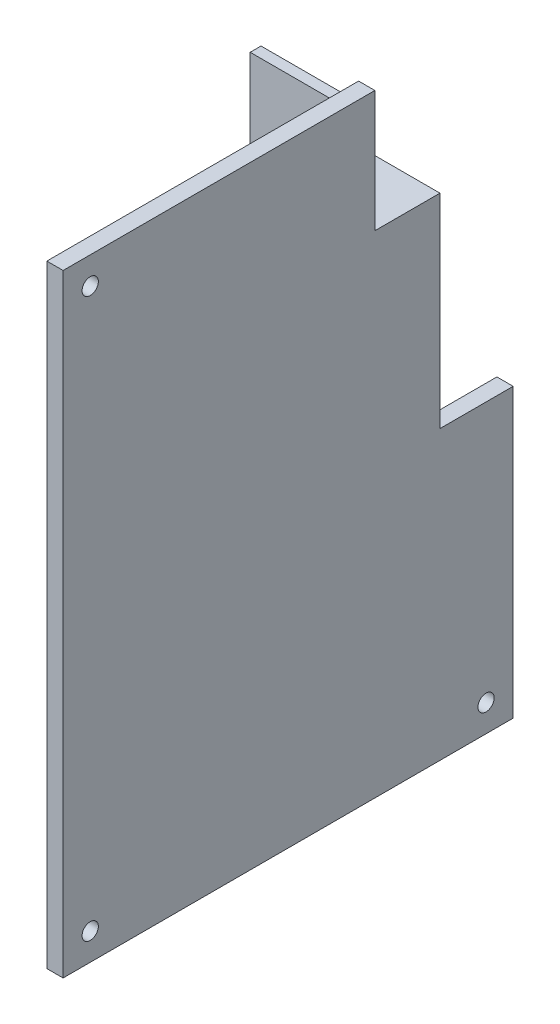
ISO-10303-21;
HEADER;
FILE_DESCRIPTION(('STEP AP214'),'2;1');
FILE_NAME('part.step','',(''),(''),'','','');
FILE_SCHEMA(('AUTOMOTIVE_DESIGN { 1 0 10303 214 1 1 1 1 }'));
ENDSEC;
DATA;
#1=APPLICATION_CONTEXT('core data for automotive mechanical design processes');
#2=APPLICATION_PROTOCOL_DEFINITION('international standard','automotive_design',2000,#1);
#3=PRODUCT_CONTEXT('',#1,'mechanical');
#4=PRODUCT('Part','Part','',(#3));
#5=PRODUCT_RELATED_PRODUCT_CATEGORY('part','',(#4));
#6=PRODUCT_DEFINITION_FORMATION('','',#4);
#7=PRODUCT_DEFINITION_CONTEXT('part definition',#1,'design');
#8=PRODUCT_DEFINITION('design','',#6,#7);
#9=PRODUCT_DEFINITION_SHAPE('','',#8);
#10=(LENGTH_UNIT() NAMED_UNIT(*) SI_UNIT(.MILLI.,.METRE.));
#11=(NAMED_UNIT(*) PLANE_ANGLE_UNIT() SI_UNIT($,.RADIAN.));
#12=(NAMED_UNIT(*) SI_UNIT($,.STERADIAN.) SOLID_ANGLE_UNIT());
#13=UNCERTAINTY_MEASURE_WITH_UNIT(LENGTH_MEASURE(1.E-05),#10,'distance_accuracy_value','');
#14=(GEOMETRIC_REPRESENTATION_CONTEXT(3) GLOBAL_UNCERTAINTY_ASSIGNED_CONTEXT((#13)) GLOBAL_UNIT_ASSIGNED_CONTEXT((#10,
#11,#12)) REPRESENTATION_CONTEXT('',''));
#15=CARTESIAN_POINT('',(0.,0.,0.));
#16=DIRECTION('',(0.,0.,1.));
#17=DIRECTION('',(1.,0.,0.));
#18=AXIS2_PLACEMENT_3D('',#15,#16,#17);
#19=CARTESIAN_POINT('',(3.,0.,0.));
#20=DIRECTION('',(-1.,0.,0.));
#21=DIRECTION('',(0.,0.,1.));
#22=AXIS2_PLACEMENT_3D('',#19,#20,#21);
#23=PLANE('',#22);
#24=DIRECTION('',(0.,1.,0.));
#25=VECTOR('',#24,1.);
#26=CARTESIAN_POINT('',(3.,28.5460512115322,-13.3949177557032));
#27=LINE('',#26,#25);
#28=CARTESIAN_POINT('',(3.,28.5460512115322,-13.3949177557032));
#29=VERTEX_POINT('',#28);
#30=CARTESIAN_POINT('',(3.,50.9457262740567,-13.3949177557032));
#31=VERTEX_POINT('',#30);
#32=EDGE_CURVE('E92',#29,#31,#27,.T.);
#33=ORIENTED_EDGE('',*,*,#32,.T.);
#34=DIRECTION('',(0.,0.,1.));
#35=VECTOR('',#34,1.);
#36=CARTESIAN_POINT('',(3.,50.9457262740567,-13.3949177557032));
#37=LINE('',#36,#35);
#38=CARTESIAN_POINT('',(3.,50.9457262740567,44.1050822442968));
#39=VERTEX_POINT('',#38);
#40=EDGE_CURVE('E108',#31,#39,#37,.T.);
#41=ORIENTED_EDGE('',*,*,#40,.T.);
#42=DIRECTION('',(0.,-1.,0.));
#43=VECTOR('',#42,1.);
#44=CARTESIAN_POINT('',(3.,50.9457262740567,44.1050822442968));
#45=LINE('',#44,#43);
#46=CARTESIAN_POINT('',(3.,-62.0542737259433,44.1050822442968));
#47=VERTEX_POINT('',#46);
#48=EDGE_CURVE('E102',#39,#47,#45,.T.);
#49=ORIENTED_EDGE('',*,*,#48,.T.);
#50=DIRECTION('',(0.,0.,-1.));
#51=VECTOR('',#50,1.);
#52=CARTESIAN_POINT('',(3.,-62.0542737259433,44.1050822442968));
#53=LINE('',#52,#51);
#54=CARTESIAN_POINT('',(3.,-62.0542737259433,-38.8949177557033));
#55=VERTEX_POINT('',#54);
#56=EDGE_CURVE('E106',#47,#55,#53,.T.);
#57=ORIENTED_EDGE('',*,*,#56,.T.);
#58=DIRECTION('',(0.,1.,0.));
#59=VECTOR('',#58,1.);
#60=CARTESIAN_POINT('',(3.,-62.0542737259433,-38.8949177557033));
#61=LINE('',#60,#59);
#62=CARTESIAN_POINT('',(3.,-9.05427372594329,-38.8949177557033));
#63=VERTEX_POINT('',#62);
#64=EDGE_CURVE('E56',#55,#63,#61,.T.);
#65=ORIENTED_EDGE('',*,*,#64,.T.);
#66=DIRECTION('',(0.,0.,1.));
#67=VECTOR('',#66,1.);
#68=CARTESIAN_POINT('',(3.,-9.05427372594329,-38.8949177557033));
#69=LINE('',#68,#67);
#70=CARTESIAN_POINT('',(3.,-9.05427372594329,-25.3949177557033));
#71=VERTEX_POINT('',#70);
#72=EDGE_CURVE('E122',#63,#71,#69,.T.);
#73=ORIENTED_EDGE('',*,*,#72,.T.);
#74=DIRECTION('',(0.,1.,0.));
#75=VECTOR('',#74,1.);
#76=CARTESIAN_POINT('',(3.,28.5460512115322,-25.3949177557033));
#77=LINE('',#76,#75);
#78=CARTESIAN_POINT('',(3.,28.5460512115322,-25.3949177557033));
#79=VERTEX_POINT('',#78);
#80=EDGE_CURVE('E185',#71,#79,#77,.T.);
#81=ORIENTED_EDGE('',*,*,#80,.T.);
#82=DIRECTION('',(0.,0.,1.));
#83=VECTOR('',#82,1.);
#84=CARTESIAN_POINT('',(3.,28.5460512115322,-23.3949177557033));
#85=LINE('',#84,#83);
#86=EDGE_CURVE('E142',#79,#29,#85,.T.);
#87=ORIENTED_EDGE('',*,*,#86,.T.);
#88=EDGE_LOOP('',(#33,#41,#49,#57,#65,#73,#81,#87));
#89=FACE_BOUND('',#88,.T.);
#90=CARTESIAN_POINT('',(3.,-57.0542737259433,-33.8949177557033));
#91=DIRECTION('',(1.,0.,0.));
#92=DIRECTION('',(0.,0.,-1.));
#93=AXIS2_PLACEMENT_3D('',#90,#91,#92);
#94=CIRCLE('',#93,1.5);
#95=CARTESIAN_POINT('',(3.,-57.0542737259433,-35.3949177557033));
#96=VERTEX_POINT('',#95);
#97=EDGE_CURVE('E131',#96,#96,#94,.T.);
#98=ORIENTED_EDGE('',*,*,#97,.F.);
#99=EDGE_LOOP('',(#98));
#100=FACE_BOUND('',#99,.T.);
#101=CARTESIAN_POINT('',(3.,-57.0542737259433,39.1050822442967));
#102=DIRECTION('',(1.,0.,0.));
#103=DIRECTION('',(0.,0.,-1.));
#104=AXIS2_PLACEMENT_3D('',#101,#102,#103);
#105=CIRCLE('',#104,1.5);
#106=CARTESIAN_POINT('',(3.,-57.0542737259433,37.6050822442967));
#107=VERTEX_POINT('',#106);
#108=EDGE_CURVE('E223',#107,#107,#105,.T.);
#109=ORIENTED_EDGE('',*,*,#108,.F.);
#110=EDGE_LOOP('',(#109));
#111=FACE_BOUND('',#110,.T.);
#112=CARTESIAN_POINT('',(3.,45.9457262740567,39.1050822442967));
#113=DIRECTION('',(1.,0.,0.));
#114=DIRECTION('',(0.,0.,-1.));
#115=AXIS2_PLACEMENT_3D('',#112,#113,#114);
#116=CIRCLE('',#115,1.5);
#117=CARTESIAN_POINT('',(3.,45.9457262740567,37.6050822442967));
#118=VERTEX_POINT('',#117);
#119=EDGE_CURVE('E217',#118,#118,#116,.T.);
#120=ORIENTED_EDGE('',*,*,#119,.F.);
#121=EDGE_LOOP('',(#120));
#122=FACE_BOUND('',#121,.T.);
#123=ADVANCED_FACE('F39',(#89,#100,#111,#122),#23,.F.);
#124=CARTESIAN_POINT('',(0.,0.,0.));
#125=DIRECTION('',(-1.,0.,0.));
#126=DIRECTION('',(0.,0.,1.));
#127=AXIS2_PLACEMENT_3D('',#124,#125,#126);
#128=PLANE('',#127);
#129=DIRECTION('',(0.,0.,-1.));
#130=VECTOR('',#129,1.);
#131=CARTESIAN_POINT('',(0.,47.5457262740567,0.));
#132=LINE('',#131,#130);
#133=CARTESIAN_POINT('',(0.,47.5457262740567,-11.3949177557032));
#134=VERTEX_POINT('',#133);
#135=CARTESIAN_POINT('',(0.,47.5457262740567,-13.3949177557032));
#136=VERTEX_POINT('',#135);
#137=EDGE_CURVE('E213',#134,#136,#132,.T.);
#138=ORIENTED_EDGE('',*,*,#137,.F.);
#139=DIRECTION('',(0.,1.,0.));
#140=VECTOR('',#139,1.);
#141=CARTESIAN_POINT('',(0.,0.,-11.3949177557032));
#142=LINE('',#141,#140);
#143=CARTESIAN_POINT('',(0.,26.5457262740567,-11.3949177557032));
#144=VERTEX_POINT('',#143);
#145=EDGE_CURVE('E11',#144,#134,#142,.T.);
#146=ORIENTED_EDGE('',*,*,#145,.F.);
#147=DIRECTION('',(0.,0.,1.));
#148=VECTOR('',#147,1.);
#149=CARTESIAN_POINT('',(0.,26.5457262740567,0.));
#150=LINE('',#149,#148);
#151=CARTESIAN_POINT('',(0.,26.5457262740567,-23.3949177557033));
#152=VERTEX_POINT('',#151);
#153=EDGE_CURVE('E188',#152,#144,#150,.T.);
#154=ORIENTED_EDGE('',*,*,#153,.F.);
#155=DIRECTION('',(0.,1.,0.));
#156=VECTOR('',#155,1.);
#157=CARTESIAN_POINT('',(0.,-9.05427372594329,-23.3949177557033));
#158=LINE('',#157,#156);
#159=CARTESIAN_POINT('',(0.,-9.05427372594329,-23.3949177557033));
#160=VERTEX_POINT('',#159);
#161=EDGE_CURVE('E139',#160,#152,#158,.T.);
#162=ORIENTED_EDGE('',*,*,#161,.F.);
#163=DIRECTION('',(0.,0.,1.));
#164=VECTOR('',#163,1.);
#165=CARTESIAN_POINT('',(0.,-9.05427372594329,0.));
#166=LINE('',#165,#164);
#167=CARTESIAN_POINT('',(0.,-9.05427372594329,-25.3949177557033));
#168=VERTEX_POINT('',#167);
#169=EDGE_CURVE('E210',#168,#160,#166,.T.);
#170=ORIENTED_EDGE('',*,*,#169,.F.);
#171=DIRECTION('',(0.,0.,1.));
#172=VECTOR('',#171,1.);
#173=CARTESIAN_POINT('',(0.,-9.05427372594329,-38.8949177557033));
#174=LINE('',#173,#172);
#175=CARTESIAN_POINT('',(0.,-9.05427372594329,-38.8949177557033));
#176=VERTEX_POINT('',#175);
#177=EDGE_CURVE('E136',#176,#168,#174,.T.);
#178=ORIENTED_EDGE('',*,*,#177,.F.);
#179=DIRECTION('',(0.,1.,0.));
#180=VECTOR('',#179,1.);
#181=CARTESIAN_POINT('',(0.,-62.0542737259433,-38.8949177557033));
#182=LINE('',#181,#180);
#183=CARTESIAN_POINT('',(0.,-62.0542737259433,-38.8949177557033));
#184=VERTEX_POINT('',#183);
#185=EDGE_CURVE('E83',#184,#176,#182,.T.);
#186=ORIENTED_EDGE('',*,*,#185,.F.);
#187=DIRECTION('',(0.,0.,-1.));
#188=VECTOR('',#187,1.);
#189=CARTESIAN_POINT('',(0.,-62.0542737259433,44.1050822442968));
#190=LINE('',#189,#188);
#191=CARTESIAN_POINT('',(0.,-62.0542737259433,44.1050822442968));
#192=VERTEX_POINT('',#191);
#193=EDGE_CURVE('E77',#192,#184,#190,.T.);
#194=ORIENTED_EDGE('',*,*,#193,.F.);
#195=DIRECTION('',(0.,-1.,0.));
#196=VECTOR('',#195,1.);
#197=CARTESIAN_POINT('',(0.,50.9457262740567,44.1050822442968));
#198=LINE('',#197,#196);
#199=CARTESIAN_POINT('',(0.,50.9457262740567,44.1050822442968));
#200=VERTEX_POINT('',#199);
#201=EDGE_CURVE('E116',#200,#192,#198,.T.);
#202=ORIENTED_EDGE('',*,*,#201,.F.);
#203=DIRECTION('',(0.,0.,1.));
#204=VECTOR('',#203,1.);
#205=CARTESIAN_POINT('',(0.,50.9457262740567,-13.3949177557032));
#206=LINE('',#205,#204);
#207=CARTESIAN_POINT('',(0.,50.9457262740567,-13.3949177557032));
#208=VERTEX_POINT('',#207);
#209=EDGE_CURVE('E130',#208,#200,#206,.T.);
#210=ORIENTED_EDGE('',*,*,#209,.F.);
#211=DIRECTION('',(0.,1.,0.));
#212=VECTOR('',#211,1.);
#213=CARTESIAN_POINT('',(0.,47.9457262740567,-13.3949177557032));
#214=LINE('',#213,#212);
#215=EDGE_CURVE('E128',#136,#208,#214,.T.);
#216=ORIENTED_EDGE('',*,*,#215,.F.);
#217=EDGE_LOOP('',(#138,#146,#154,#162,#170,#178,#186,#194,#202,#210,#216));
#218=FACE_BOUND('',#217,.T.);
#219=CARTESIAN_POINT('',(0.,-57.0542737259433,39.1050822442967));
#220=DIRECTION('',(1.,0.,0.));
#221=DIRECTION('',(0.,0.,-1.));
#222=AXIS2_PLACEMENT_3D('',#219,#220,#221);
#223=CIRCLE('',#222,1.5);
#224=CARTESIAN_POINT('',(0.,-57.0542737259433,37.6050822442967));
#225=VERTEX_POINT('',#224);
#226=EDGE_CURVE('E220',#225,#225,#223,.T.);
#227=ORIENTED_EDGE('',*,*,#226,.T.);
#228=EDGE_LOOP('',(#227));
#229=FACE_BOUND('',#228,.T.);
#230=CARTESIAN_POINT('',(0.,-57.0542737259433,-33.8949177557033));
#231=DIRECTION('',(1.,0.,0.));
#232=DIRECTION('',(0.,0.,-1.));
#233=AXIS2_PLACEMENT_3D('',#230,#231,#232);
#234=CIRCLE('',#233,1.5);
#235=CARTESIAN_POINT('',(0.,-57.0542737259433,-35.3949177557033));
#236=VERTEX_POINT('',#235);
#237=EDGE_CURVE('E226',#236,#236,#234,.T.);
#238=ORIENTED_EDGE('',*,*,#237,.T.);
#239=EDGE_LOOP('',(#238));
#240=FACE_BOUND('',#239,.T.);
#241=CARTESIAN_POINT('',(0.,45.9457262740567,39.1050822442967));
#242=DIRECTION('',(1.,0.,0.));
#243=DIRECTION('',(0.,0.,-1.));
#244=AXIS2_PLACEMENT_3D('',#241,#242,#243);
#245=CIRCLE('',#244,1.5);
#246=CARTESIAN_POINT('',(0.,45.9457262740567,37.6050822442967));
#247=VERTEX_POINT('',#246);
#248=EDGE_CURVE('E216',#247,#247,#245,.T.);
#249=ORIENTED_EDGE('',*,*,#248,.T.);
#250=EDGE_LOOP('',(#249));
#251=FACE_BOUND('',#250,.T.);
#252=ADVANCED_FACE('F240',(#218,#229,#240,#251),#128,.T.);
#253=CARTESIAN_POINT('',(3.,28.5460512115322,-23.3949177557033));
#254=DIRECTION('',(0.,-1.,0.));
#255=DIRECTION('',(0.,0.,-1.));
#256=AXIS2_PLACEMENT_3D('',#253,#254,#255);
#257=PLANE('',#256);
#258=DIRECTION('',(0.,0.,-1.));
#259=VECTOR('',#258,1.);
#260=CARTESIAN_POINT('',(-18.,28.5460512115322,-23.3949177557033));
#261=LINE('',#260,#259);
#262=CARTESIAN_POINT('',(-18.,28.5460512115322,-13.3949177557032));
#263=VERTEX_POINT('',#262);
#264=CARTESIAN_POINT('',(-18.,28.5460512115322,-25.3949177557033));
#265=VERTEX_POINT('',#264);
#266=EDGE_CURVE('E167',#263,#265,#261,.T.);
#267=ORIENTED_EDGE('',*,*,#266,.F.);
#268=DIRECTION('',(-1.,0.,0.));
#269=VECTOR('',#268,1.);
#270=CARTESIAN_POINT('',(3.,28.5460512115322,-13.3949177557032));
#271=LINE('',#270,#269);
#272=EDGE_CURVE('E48',#29,#263,#271,.T.);
#273=ORIENTED_EDGE('',*,*,#272,.F.);
#274=ORIENTED_EDGE('',*,*,#86,.F.);
#275=DIRECTION('',(-1.,0.,0.));
#276=VECTOR('',#275,1.);
#277=CARTESIAN_POINT('',(61.3057458575053,28.5460512115322,-25.3949177557033));
#278=LINE('',#277,#276);
#279=EDGE_CURVE('E175',#79,#265,#278,.T.);
#280=ORIENTED_EDGE('',*,*,#279,.T.);
#281=EDGE_LOOP('',(#267,#273,#274,#280));
#282=FACE_BOUND('',#281,.T.);
#283=ADVANCED_FACE('F41',(#282),#257,.F.);
#284=CARTESIAN_POINT('',(3.,47.9457262740567,-13.3949177557032));
#285=DIRECTION('',(0.,0.,1.));
#286=DIRECTION('',(1.,0.,0.));
#287=AXIS2_PLACEMENT_3D('',#284,#285,#286);
#288=PLANE('',#287);
#289=DIRECTION('',(-1.,0.,0.));
#290=VECTOR('',#289,1.);
#291=CARTESIAN_POINT('',(3.,50.9457262740567,-13.3949177557032));
#292=LINE('',#291,#290);
#293=EDGE_CURVE('E146',#31,#208,#292,.T.);
#294=ORIENTED_EDGE('',*,*,#293,.F.);
#295=ORIENTED_EDGE('',*,*,#32,.F.);
#296=ORIENTED_EDGE('',*,*,#272,.T.);
#297=DIRECTION('',(0.,-1.,0.));
#298=VECTOR('',#297,1.);
#299=CARTESIAN_POINT('',(-18.,28.5460512115322,-13.3949177557032));
#300=LINE('',#299,#298);
#301=CARTESIAN_POINT('',(-18.,47.5457262740567,-13.3949177557032));
#302=VERTEX_POINT('',#301);
#303=EDGE_CURVE('E155',#302,#263,#300,.T.);
#304=ORIENTED_EDGE('',*,*,#303,.F.);
#305=DIRECTION('',(-1.,0.,0.));
#306=VECTOR('',#305,1.);
#307=CARTESIAN_POINT('',(61.3057458575053,47.5457262740567,-13.3949177557032));
#308=LINE('',#307,#306);
#309=EDGE_CURVE('E197',#136,#302,#308,.T.);
#310=ORIENTED_EDGE('',*,*,#309,.F.);
#311=ORIENTED_EDGE('',*,*,#215,.T.);
#312=EDGE_LOOP('',(#294,#295,#296,#304,#310,#311));
#313=FACE_BOUND('',#312,.T.);
#314=ADVANCED_FACE('F152',(#313),#288,.F.);
#315=CARTESIAN_POINT('',(3.,50.9457262740567,-13.3949177557032));
#316=DIRECTION('',(0.,-1.,0.));
#317=DIRECTION('',(0.,0.,-1.));
#318=AXIS2_PLACEMENT_3D('',#315,#316,#317);
#319=PLANE('',#318);
#320=ORIENTED_EDGE('',*,*,#209,.T.);
#321=DIRECTION('',(-1.,0.,0.));
#322=VECTOR('',#321,1.);
#323=CARTESIAN_POINT('',(3.,50.9457262740567,44.1050822442968));
#324=LINE('',#323,#322);
#325=EDGE_CURVE('E117',#39,#200,#324,.T.);
#326=ORIENTED_EDGE('',*,*,#325,.F.);
#327=ORIENTED_EDGE('',*,*,#40,.F.);
#328=ORIENTED_EDGE('',*,*,#293,.T.);
#329=EDGE_LOOP('',(#320,#326,#327,#328));
#330=FACE_BOUND('',#329,.T.);
#331=ADVANCED_FACE('F237',(#330),#319,.F.);
#332=CARTESIAN_POINT('',(3.,50.9457262740567,44.1050822442968));
#333=DIRECTION('',(0.,0.,-1.));
#334=DIRECTION('',(-1.,0.,0.));
#335=AXIS2_PLACEMENT_3D('',#332,#333,#334);
#336=PLANE('',#335);
#337=ORIENTED_EDGE('',*,*,#201,.T.);
#338=DIRECTION('',(-1.,0.,0.));
#339=VECTOR('',#338,1.);
#340=CARTESIAN_POINT('',(3.,-62.0542737259433,44.1050822442968));
#341=LINE('',#340,#339);
#342=EDGE_CURVE('E113',#47,#192,#341,.T.);
#343=ORIENTED_EDGE('',*,*,#342,.F.);
#344=ORIENTED_EDGE('',*,*,#48,.F.);
#345=ORIENTED_EDGE('',*,*,#325,.T.);
#346=EDGE_LOOP('',(#337,#343,#344,#345));
#347=FACE_BOUND('',#346,.T.);
#348=ADVANCED_FACE('F114',(#347),#336,.F.);
#349=CARTESIAN_POINT('',(3.,-62.0542737259433,44.1050822442968));
#350=DIRECTION('',(0.,1.,0.));
#351=DIRECTION('',(0.,0.,1.));
#352=AXIS2_PLACEMENT_3D('',#349,#350,#351);
#353=PLANE('',#352);
#354=ORIENTED_EDGE('',*,*,#193,.T.);
#355=DIRECTION('',(-1.,0.,0.));
#356=VECTOR('',#355,1.);
#357=CARTESIAN_POINT('',(3.,-62.0542737259433,-38.8949177557033));
#358=LINE('',#357,#356);
#359=EDGE_CURVE('E118',#55,#184,#358,.T.);
#360=ORIENTED_EDGE('',*,*,#359,.F.);
#361=ORIENTED_EDGE('',*,*,#56,.F.);
#362=ORIENTED_EDGE('',*,*,#342,.T.);
#363=EDGE_LOOP('',(#354,#360,#361,#362));
#364=FACE_BOUND('',#363,.T.);
#365=ADVANCED_FACE('F120',(#364),#353,.F.);
#366=CARTESIAN_POINT('',(3.,-62.0542737259433,-38.8949177557033));
#367=DIRECTION('',(0.,0.,1.));
#368=DIRECTION('',(1.,0.,0.));
#369=AXIS2_PLACEMENT_3D('',#366,#367,#368);
#370=PLANE('',#369);
#371=ORIENTED_EDGE('',*,*,#185,.T.);
#372=DIRECTION('',(-1.,0.,0.));
#373=VECTOR('',#372,1.);
#374=CARTESIAN_POINT('',(3.,-9.05427372594329,-38.8949177557033));
#375=LINE('',#374,#373);
#376=EDGE_CURVE('E127',#63,#176,#375,.T.);
#377=ORIENTED_EDGE('',*,*,#376,.F.);
#378=ORIENTED_EDGE('',*,*,#64,.F.);
#379=ORIENTED_EDGE('',*,*,#359,.T.);
#380=EDGE_LOOP('',(#371,#377,#378,#379));
#381=FACE_BOUND('',#380,.T.);
#382=ADVANCED_FACE('F325',(#381),#370,.F.);
#383=CARTESIAN_POINT('',(3.,-9.05427372594329,-38.8949177557033));
#384=DIRECTION('',(0.,-1.,0.));
#385=DIRECTION('',(0.,0.,-1.));
#386=AXIS2_PLACEMENT_3D('',#383,#384,#385);
#387=PLANE('',#386);
#388=ORIENTED_EDGE('',*,*,#177,.T.);
#389=DIRECTION('',(-1.,0.,0.));
#390=VECTOR('',#389,1.);
#391=CARTESIAN_POINT('',(61.3057458575053,-9.05427372594329,-25.3949177557033));
#392=LINE('',#391,#390);
#393=EDGE_CURVE('E192',#71,#168,#392,.T.);
#394=ORIENTED_EDGE('',*,*,#393,.F.);
#395=ORIENTED_EDGE('',*,*,#72,.F.);
#396=ORIENTED_EDGE('',*,*,#376,.T.);
#397=EDGE_LOOP('',(#388,#394,#395,#396));
#398=FACE_BOUND('',#397,.T.);
#399=ADVANCED_FACE('F248',(#398),#387,.F.);
#400=CARTESIAN_POINT('',(3.,-57.0542737259433,-33.8949177557033));
#401=DIRECTION('',(-1.,0.,0.));
#402=DIRECTION('',(0.,0.,1.));
#403=AXIS2_PLACEMENT_3D('',#400,#401,#402);
#404=CYLINDRICAL_SURFACE('',#403,1.5);
#405=ORIENTED_EDGE('',*,*,#97,.T.);
#406=EDGE_LOOP('',(#405));
#407=FACE_BOUND('',#406,.T.);
#408=ORIENTED_EDGE('',*,*,#237,.F.);
#409=EDGE_LOOP('',(#408));
#410=FACE_BOUND('',#409,.T.);
#411=ADVANCED_FACE('F320',(#407,#410),#404,.F.);
#412=CARTESIAN_POINT('',(3.,-57.0542737259433,39.1050822442967));
#413=DIRECTION('',(-1.,0.,0.));
#414=DIRECTION('',(0.,0.,1.));
#415=AXIS2_PLACEMENT_3D('',#412,#413,#414);
#416=CYLINDRICAL_SURFACE('',#415,1.5);
#417=ORIENTED_EDGE('',*,*,#108,.T.);
#418=EDGE_LOOP('',(#417));
#419=FACE_BOUND('',#418,.T.);
#420=ORIENTED_EDGE('',*,*,#226,.F.);
#421=EDGE_LOOP('',(#420));
#422=FACE_BOUND('',#421,.T.);
#423=ADVANCED_FACE('F407',(#419,#422),#416,.F.);
#424=CARTESIAN_POINT('',(3.,45.9457262740567,39.1050822442967));
#425=DIRECTION('',(-1.,0.,0.));
#426=DIRECTION('',(0.,0.,1.));
#427=AXIS2_PLACEMENT_3D('',#424,#425,#426);
#428=CYLINDRICAL_SURFACE('',#427,1.5);
#429=ORIENTED_EDGE('',*,*,#119,.T.);
#430=EDGE_LOOP('',(#429));
#431=FACE_BOUND('',#430,.T.);
#432=ORIENTED_EDGE('',*,*,#248,.F.);
#433=EDGE_LOOP('',(#432));
#434=FACE_BOUND('',#433,.T.);
#435=ADVANCED_FACE('F416',(#431,#434),#428,.F.);
#436=CARTESIAN_POINT('',(61.3057458575053,-9.05427372594329,-23.3949177557033));
#437=DIRECTION('',(0.,0.,1.));
#438=DIRECTION('',(1.,0.,0.));
#439=AXIS2_PLACEMENT_3D('',#436,#437,#438);
#440=PLANE('',#439);
#441=DIRECTION('',(-1.,0.,0.));
#442=VECTOR('',#441,1.);
#443=CARTESIAN_POINT('',(61.3057458575053,-9.05427372594329,-23.3949177557033));
#444=LINE('',#443,#442);
#445=CARTESIAN_POINT('',(-18.,-9.05427372594329,-23.3949177557033));
#446=VERTEX_POINT('',#445);
#447=EDGE_CURVE('E189',#160,#446,#444,.T.);
#448=ORIENTED_EDGE('',*,*,#447,.F.);
#449=ORIENTED_EDGE('',*,*,#161,.T.);
#450=DIRECTION('',(-1.,0.,0.));
#451=VECTOR('',#450,1.);
#452=CARTESIAN_POINT('',(61.3057458575053,26.5457262740567,-23.3949177557033));
#453=LINE('',#452,#451);
#454=CARTESIAN_POINT('',(-18.,26.5457262740567,-23.3949177557033));
#455=VERTEX_POINT('',#454);
#456=EDGE_CURVE('E184',#152,#455,#453,.T.);
#457=ORIENTED_EDGE('',*,*,#456,.T.);
#458=DIRECTION('',(0.,1.,0.));
#459=VECTOR('',#458,1.);
#460=CARTESIAN_POINT('',(-18.,-9.05427372594329,-23.3949177557033));
#461=LINE('',#460,#459);
#462=EDGE_CURVE('E285',#446,#455,#461,.T.);
#463=ORIENTED_EDGE('',*,*,#462,.F.);
#464=EDGE_LOOP('',(#448,#449,#457,#463));
#465=FACE_BOUND('',#464,.T.);
#466=ADVANCED_FACE('F284',(#465),#440,.T.);
#467=CARTESIAN_POINT('',(61.3057458575053,-9.05427372594329,-23.3949177557033));
#468=DIRECTION('',(0.,-1.,0.));
#469=DIRECTION('',(0.,0.,-1.));
#470=AXIS2_PLACEMENT_3D('',#467,#468,#469);
#471=PLANE('',#470);
#472=CARTESIAN_POINT('',(-18.,-9.05427372594329,-25.3949177557033));
#473=VERTEX_POINT('',#472);
#474=EDGE_CURVE('E195',#168,#473,#392,.T.);
#475=ORIENTED_EDGE('',*,*,#474,.F.);
#476=ORIENTED_EDGE('',*,*,#169,.T.);
#477=ORIENTED_EDGE('',*,*,#447,.T.);
#478=DIRECTION('',(0.,0.,1.));
#479=VECTOR('',#478,1.);
#480=CARTESIAN_POINT('',(-18.,-9.05427372594329,-23.3949177557033));
#481=LINE('',#480,#479);
#482=EDGE_CURVE('E178',#473,#446,#481,.T.);
#483=ORIENTED_EDGE('',*,*,#482,.F.);
#484=EDGE_LOOP('',(#475,#476,#477,#483));
#485=FACE_BOUND('',#484,.T.);
#486=ADVANCED_FACE('F432',(#485),#471,.T.);
#487=CARTESIAN_POINT('',(61.3057458575053,28.5460512115322,-25.3949177557033));
#488=DIRECTION('',(0.,0.,-1.));
#489=DIRECTION('',(-1.,0.,0.));
#490=AXIS2_PLACEMENT_3D('',#487,#488,#489);
#491=PLANE('',#490);
#492=ORIENTED_EDGE('',*,*,#80,.F.);
#493=ORIENTED_EDGE('',*,*,#393,.T.);
#494=ORIENTED_EDGE('',*,*,#474,.T.);
#495=DIRECTION('',(0.,-1.,0.));
#496=VECTOR('',#495,1.);
#497=CARTESIAN_POINT('',(-18.,28.5460512115322,-25.3949177557033));
#498=LINE('',#497,#496);
#499=EDGE_CURVE('E176',#265,#473,#498,.T.);
#500=ORIENTED_EDGE('',*,*,#499,.F.);
#501=ORIENTED_EDGE('',*,*,#279,.F.);
#502=EDGE_LOOP('',(#492,#493,#494,#500,#501));
#503=FACE_BOUND('',#502,.T.);
#504=ADVANCED_FACE('F310',(#503),#491,.T.);
#505=CARTESIAN_POINT('',(61.3057458575053,47.5457262740567,-13.3949177557032));
#506=DIRECTION('',(0.,1.,0.));
#507=DIRECTION('',(0.,0.,1.));
#508=AXIS2_PLACEMENT_3D('',#505,#506,#507);
#509=PLANE('',#508);
#510=DIRECTION('',(-1.,0.,0.));
#511=VECTOR('',#510,1.);
#512=CARTESIAN_POINT('',(61.3057458575053,47.5457262740567,-11.3949177557032));
#513=LINE('',#512,#511);
#514=CARTESIAN_POINT('',(-18.,47.5457262740567,-11.3949177557032));
#515=VERTEX_POINT('',#514);
#516=EDGE_CURVE('E200',#134,#515,#513,.T.);
#517=ORIENTED_EDGE('',*,*,#516,.F.);
#518=ORIENTED_EDGE('',*,*,#137,.T.);
#519=ORIENTED_EDGE('',*,*,#309,.T.);
#520=DIRECTION('',(0.,0.,-1.));
#521=VECTOR('',#520,1.);
#522=CARTESIAN_POINT('',(-18.,47.5457262740567,-13.3949177557032));
#523=LINE('',#522,#521);
#524=EDGE_CURVE('E171',#515,#302,#523,.T.);
#525=ORIENTED_EDGE('',*,*,#524,.F.);
#526=EDGE_LOOP('',(#517,#518,#519,#525));
#527=FACE_BOUND('',#526,.T.);
#528=ADVANCED_FACE('F300',(#527),#509,.T.);
#529=CARTESIAN_POINT('',(61.3057458575053,26.5457262740567,-11.3949177557032));
#530=DIRECTION('',(0.,0.,1.));
#531=DIRECTION('',(1.,0.,0.));
#532=AXIS2_PLACEMENT_3D('',#529,#530,#531);
#533=PLANE('',#532);
#534=DIRECTION('',(-1.,0.,0.));
#535=VECTOR('',#534,1.);
#536=CARTESIAN_POINT('',(61.3057458575053,26.5457262740567,-11.3949177557032));
#537=LINE('',#536,#535);
#538=CARTESIAN_POINT('',(-18.,26.5457262740567,-11.3949177557032));
#539=VERTEX_POINT('',#538);
#540=EDGE_CURVE('E203',#144,#539,#537,.T.);
#541=ORIENTED_EDGE('',*,*,#540,.F.);
#542=ORIENTED_EDGE('',*,*,#145,.T.);
#543=ORIENTED_EDGE('',*,*,#516,.T.);
#544=DIRECTION('',(0.,1.,0.));
#545=VECTOR('',#544,1.);
#546=CARTESIAN_POINT('',(-18.,26.5457262740567,-11.3949177557032));
#547=LINE('',#546,#545);
#548=EDGE_CURVE('E293',#539,#515,#547,.T.);
#549=ORIENTED_EDGE('',*,*,#548,.F.);
#550=EDGE_LOOP('',(#541,#542,#543,#549));
#551=FACE_BOUND('',#550,.T.);
#552=ADVANCED_FACE('F302',(#551),#533,.T.);
#553=CARTESIAN_POINT('',(61.3057458575053,26.5457262740567,-23.3949177557033));
#554=DIRECTION('',(0.,-1.,0.));
#555=DIRECTION('',(0.,0.,-1.));
#556=AXIS2_PLACEMENT_3D('',#553,#554,#555);
#557=PLANE('',#556);
#558=ORIENTED_EDGE('',*,*,#456,.F.);
#559=ORIENTED_EDGE('',*,*,#153,.T.);
#560=ORIENTED_EDGE('',*,*,#540,.T.);
#561=DIRECTION('',(0.,0.,1.));
#562=VECTOR('',#561,1.);
#563=CARTESIAN_POINT('',(-18.,26.5457262740567,-23.3949177557033));
#564=LINE('',#563,#562);
#565=EDGE_CURVE('E289',#455,#539,#564,.T.);
#566=ORIENTED_EDGE('',*,*,#565,.F.);
#567=EDGE_LOOP('',(#558,#559,#560,#566));
#568=FACE_BOUND('',#567,.T.);
#569=ADVANCED_FACE('F290',(#568),#557,.T.);
#570=CARTESIAN_POINT('',(-18.,0.,0.));
#571=DIRECTION('',(1.,0.,0.));
#572=DIRECTION('',(0.,0.,-1.));
#573=AXIS2_PLACEMENT_3D('',#570,#571,#572);
#574=PLANE('',#573);
#575=ORIENTED_EDGE('',*,*,#462,.T.);
#576=ORIENTED_EDGE('',*,*,#565,.T.);
#577=ORIENTED_EDGE('',*,*,#548,.T.);
#578=ORIENTED_EDGE('',*,*,#524,.T.);
#579=ORIENTED_EDGE('',*,*,#303,.T.);
#580=ORIENTED_EDGE('',*,*,#266,.T.);
#581=ORIENTED_EDGE('',*,*,#499,.T.);
#582=ORIENTED_EDGE('',*,*,#482,.T.);
#583=EDGE_LOOP('',(#575,#576,#577,#578,#579,#580,#581,#582));
#584=FACE_BOUND('',#583,.T.);
#585=ADVANCED_FACE('F165',(#584),#574,.F.);
#586=CLOSED_SHELL('',(#123,#252,#283,#314,#331,#348,#365,#382,#399,#411,#423,#435,#466,#486,
#504,#528,#552,#569,#585));
#587=MANIFOLD_SOLID_BREP('B2',#586);
#588=ADVANCED_BREP_SHAPE_REPRESENTATION('',(#18,#587),#14);
#589=SHAPE_DEFINITION_REPRESENTATION(#9,#588);
ENDSEC;
END-ISO-10303-21;
